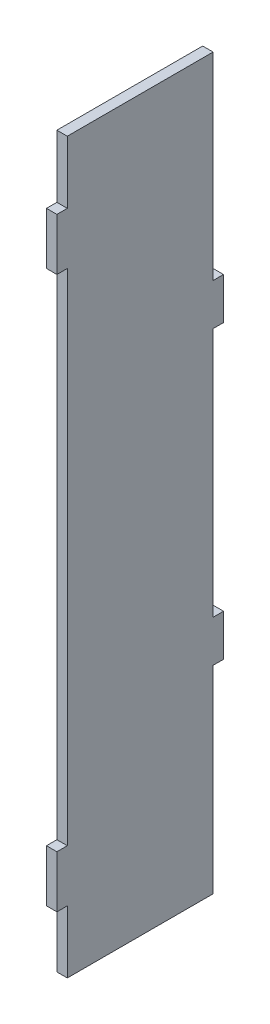
ISO-10303-21;
HEADER;
FILE_DESCRIPTION(('STEP AP214'),'2;1');
FILE_NAME('part.step','',(''),(''),'','','');
FILE_SCHEMA(('AUTOMOTIVE_DESIGN { 1 0 10303 214 1 1 1 1 }'));
ENDSEC;
DATA;
#1=APPLICATION_CONTEXT('core data for automotive mechanical design processes');
#2=APPLICATION_PROTOCOL_DEFINITION('international standard','automotive_design',2000,#1);
#3=PRODUCT_CONTEXT('',#1,'mechanical');
#4=PRODUCT('Part','Part','',(#3));
#5=PRODUCT_RELATED_PRODUCT_CATEGORY('part','',(#4));
#6=PRODUCT_DEFINITION_FORMATION('','',#4);
#7=PRODUCT_DEFINITION_CONTEXT('part definition',#1,'design');
#8=PRODUCT_DEFINITION('design','',#6,#7);
#9=PRODUCT_DEFINITION_SHAPE('','',#8);
#10=(LENGTH_UNIT() NAMED_UNIT(*) SI_UNIT(.MILLI.,.METRE.));
#11=(NAMED_UNIT(*) PLANE_ANGLE_UNIT() SI_UNIT($,.RADIAN.));
#12=(NAMED_UNIT(*) SI_UNIT($,.STERADIAN.) SOLID_ANGLE_UNIT());
#13=UNCERTAINTY_MEASURE_WITH_UNIT(LENGTH_MEASURE(1.E-05),#10,'distance_accuracy_value','');
#14=(GEOMETRIC_REPRESENTATION_CONTEXT(3) GLOBAL_UNCERTAINTY_ASSIGNED_CONTEXT((#13)) GLOBAL_UNIT_ASSIGNED_CONTEXT((#10,
#11,#12)) REPRESENTATION_CONTEXT('',''));
#15=CARTESIAN_POINT('',(0.,0.,0.));
#16=DIRECTION('',(0.,0.,1.));
#17=DIRECTION('',(1.,0.,0.));
#18=AXIS2_PLACEMENT_3D('',#15,#16,#17);
#19=CARTESIAN_POINT('',(5.,311.382366838523,56.6048264526681));
#20=DIRECTION('',(0.,0.,-1.));
#21=DIRECTION('',(0.,1.,0.));
#22=AXIS2_PLACEMENT_3D('',#19,#20,#21);
#23=PLANE('',#22);
#24=DIRECTION('',(0.,-1.,0.));
#25=VECTOR('',#24,1.);
#26=CARTESIAN_POINT('',(0.,311.382366838523,56.6048264526681));
#27=LINE('',#26,#25);
#28=CARTESIAN_POINT('',(0.,311.382366838523,56.6048264526681));
#29=VERTEX_POINT('',#28);
#30=CARTESIAN_POINT('',(0.,281.382366838523,56.604826452668));
#31=VERTEX_POINT('',#30);
#32=EDGE_CURVE('E200',#29,#31,#27,.T.);
#33=ORIENTED_EDGE('',*,*,#32,.T.);
#34=DIRECTION('',(-1.,0.,0.));
#35=VECTOR('',#34,1.);
#36=CARTESIAN_POINT('',(5.,281.382366838523,56.604826452668));
#37=LINE('',#36,#35);
#38=CARTESIAN_POINT('',(5.,281.382366838523,56.604826452668));
#39=VERTEX_POINT('',#38);
#40=EDGE_CURVE('E11',#39,#31,#37,.T.);
#41=ORIENTED_EDGE('',*,*,#40,.F.);
#42=DIRECTION('',(0.,-1.,0.));
#43=VECTOR('',#42,1.);
#44=CARTESIAN_POINT('',(5.,311.382366838523,56.6048264526681));
#45=LINE('',#44,#43);
#46=CARTESIAN_POINT('',(5.,311.382366838523,56.6048264526681));
#47=VERTEX_POINT('',#46);
#48=EDGE_CURVE('E238',#47,#39,#45,.T.);
#49=ORIENTED_EDGE('',*,*,#48,.F.);
#50=DIRECTION('',(-1.,0.,0.));
#51=VECTOR('',#50,1.);
#52=CARTESIAN_POINT('',(5.,311.382366838523,56.6048264526681));
#53=LINE('',#52,#51);
#54=EDGE_CURVE('E196',#47,#29,#53,.T.);
#55=ORIENTED_EDGE('',*,*,#54,.T.);
#56=EDGE_LOOP('',(#33,#41,#49,#55));
#57=FACE_BOUND('',#56,.T.);
#58=ADVANCED_FACE('F32',(#57),#23,.F.);
#59=CARTESIAN_POINT('',(5.,281.382366838523,56.604826452668));
#60=DIRECTION('',(0.,-1.,0.));
#61=DIRECTION('',(0.,0.,-1.));
#62=AXIS2_PLACEMENT_3D('',#59,#60,#61);
#63=PLANE('',#62);
#64=DIRECTION('',(0.,0.,1.));
#65=VECTOR('',#64,1.);
#66=CARTESIAN_POINT('',(0.,281.382366838523,56.604826452668));
#67=LINE('',#66,#65);
#68=CARTESIAN_POINT('',(0.,281.382366838523,61.604826452668));
#69=VERTEX_POINT('',#68);
#70=EDGE_CURVE('E203',#31,#69,#67,.T.);
#71=ORIENTED_EDGE('',*,*,#70,.T.);
#72=DIRECTION('',(-1.,0.,0.));
#73=VECTOR('',#72,1.);
#74=CARTESIAN_POINT('',(5.,281.382366838523,61.604826452668));
#75=LINE('',#74,#73);
#76=CARTESIAN_POINT('',(5.,281.382366838523,61.604826452668));
#77=VERTEX_POINT('',#76);
#78=EDGE_CURVE('E40',#77,#69,#75,.T.);
#79=ORIENTED_EDGE('',*,*,#78,.F.);
#80=DIRECTION('',(0.,0.,1.));
#81=VECTOR('',#80,1.);
#82=CARTESIAN_POINT('',(5.,281.382366838523,56.604826452668));
#83=LINE('',#82,#81);
#84=EDGE_CURVE('E127',#39,#77,#83,.T.);
#85=ORIENTED_EDGE('',*,*,#84,.F.);
#86=ORIENTED_EDGE('',*,*,#40,.T.);
#87=EDGE_LOOP('',(#71,#79,#85,#86));
#88=FACE_BOUND('',#87,.T.);
#89=ADVANCED_FACE('F356',(#88),#63,.F.);
#90=CARTESIAN_POINT('',(5.,281.382366838523,61.604826452668));
#91=DIRECTION('',(0.,0.,-1.));
#92=DIRECTION('',(0.,1.,0.));
#93=AXIS2_PLACEMENT_3D('',#90,#91,#92);
#94=PLANE('',#93);
#95=DIRECTION('',(0.,-1.,0.));
#96=VECTOR('',#95,1.);
#97=CARTESIAN_POINT('',(0.,281.382366838523,61.604826452668));
#98=LINE('',#97,#96);
#99=CARTESIAN_POINT('',(0.,256.382366838523,61.6048264526681));
#100=VERTEX_POINT('',#99);
#101=EDGE_CURVE('E205',#69,#100,#98,.T.);
#102=ORIENTED_EDGE('',*,*,#101,.T.);
#103=DIRECTION('',(-1.,0.,0.));
#104=VECTOR('',#103,1.);
#105=CARTESIAN_POINT('',(5.,256.382366838523,61.6048264526681));
#106=LINE('',#105,#104);
#107=CARTESIAN_POINT('',(5.,256.382366838523,61.6048264526681));
#108=VERTEX_POINT('',#107);
#109=EDGE_CURVE('E281',#108,#100,#106,.T.);
#110=ORIENTED_EDGE('',*,*,#109,.F.);
#111=DIRECTION('',(0.,-1.,0.));
#112=VECTOR('',#111,1.);
#113=CARTESIAN_POINT('',(5.,281.382366838523,61.604826452668));
#114=LINE('',#113,#112);
#115=EDGE_CURVE('E289',#77,#108,#114,.T.);
#116=ORIENTED_EDGE('',*,*,#115,.F.);
#117=ORIENTED_EDGE('',*,*,#78,.T.);
#118=EDGE_LOOP('',(#102,#110,#116,#117));
#119=FACE_BOUND('',#118,.T.);
#120=ADVANCED_FACE('F287',(#119),#94,.F.);
#121=CARTESIAN_POINT('',(5.,256.382366838523,61.6048264526681));
#122=DIRECTION('',(0.,1.,0.));
#123=DIRECTION('',(0.,0.,1.));
#124=AXIS2_PLACEMENT_3D('',#121,#122,#123);
#125=PLANE('',#124);
#126=DIRECTION('',(0.,0.,-1.));
#127=VECTOR('',#126,1.);
#128=CARTESIAN_POINT('',(0.,256.382366838523,61.6048264526681));
#129=LINE('',#128,#127);
#130=CARTESIAN_POINT('',(0.,256.382366838523,56.6048264526681));
#131=VERTEX_POINT('',#130);
#132=EDGE_CURVE('E207',#100,#131,#129,.T.);
#133=ORIENTED_EDGE('',*,*,#132,.T.);
#134=DIRECTION('',(-1.,0.,0.));
#135=VECTOR('',#134,1.);
#136=CARTESIAN_POINT('',(5.,256.382366838523,56.6048264526681));
#137=LINE('',#136,#135);
#138=CARTESIAN_POINT('',(5.,256.382366838523,56.6048264526681));
#139=VERTEX_POINT('',#138);
#140=EDGE_CURVE('E278',#139,#131,#137,.T.);
#141=ORIENTED_EDGE('',*,*,#140,.F.);
#142=DIRECTION('',(0.,0.,-1.));
#143=VECTOR('',#142,1.);
#144=CARTESIAN_POINT('',(5.,256.382366838523,61.6048264526681));
#145=LINE('',#144,#143);
#146=EDGE_CURVE('E307',#108,#139,#145,.T.);
#147=ORIENTED_EDGE('',*,*,#146,.F.);
#148=ORIENTED_EDGE('',*,*,#109,.T.);
#149=EDGE_LOOP('',(#133,#141,#147,#148));
#150=FACE_BOUND('',#149,.T.);
#151=ADVANCED_FACE('F298',(#150),#125,.F.);
#152=CARTESIAN_POINT('',(5.,256.382366838523,56.6048264526681));
#153=DIRECTION('',(0.,0.,-1.));
#154=DIRECTION('',(0.,1.,0.));
#155=AXIS2_PLACEMENT_3D('',#152,#153,#154);
#156=PLANE('',#155);
#157=DIRECTION('',(0.,-1.,0.));
#158=VECTOR('',#157,1.);
#159=CARTESIAN_POINT('',(0.,256.382366838523,56.6048264526681));
#160=LINE('',#159,#158);
#161=CARTESIAN_POINT('',(0.,16.3823668385227,56.604826452668));
#162=VERTEX_POINT('',#161);
#163=EDGE_CURVE('E209',#131,#162,#160,.T.);
#164=ORIENTED_EDGE('',*,*,#163,.T.);
#165=DIRECTION('',(-1.,0.,0.));
#166=VECTOR('',#165,1.);
#167=CARTESIAN_POINT('',(5.,16.3823668385227,56.604826452668));
#168=LINE('',#167,#166);
#169=CARTESIAN_POINT('',(5.,16.3823668385227,56.604826452668));
#170=VERTEX_POINT('',#169);
#171=EDGE_CURVE('E275',#170,#162,#168,.T.);
#172=ORIENTED_EDGE('',*,*,#171,.F.);
#173=DIRECTION('',(0.,-1.,0.));
#174=VECTOR('',#173,1.);
#175=CARTESIAN_POINT('',(5.,256.382366838523,56.6048264526681));
#176=LINE('',#175,#174);
#177=EDGE_CURVE('E304',#139,#170,#176,.T.);
#178=ORIENTED_EDGE('',*,*,#177,.F.);
#179=ORIENTED_EDGE('',*,*,#140,.T.);
#180=EDGE_LOOP('',(#164,#172,#178,#179));
#181=FACE_BOUND('',#180,.T.);
#182=ADVANCED_FACE('F302',(#181),#156,.F.);
#183=CARTESIAN_POINT('',(5.,16.3823668385227,56.604826452668));
#184=DIRECTION('',(0.,-1.,0.));
#185=DIRECTION('',(0.,0.,-1.));
#186=AXIS2_PLACEMENT_3D('',#183,#184,#185);
#187=PLANE('',#186);
#188=DIRECTION('',(0.,0.,1.));
#189=VECTOR('',#188,1.);
#190=CARTESIAN_POINT('',(0.,16.3823668385227,56.604826452668));
#191=LINE('',#190,#189);
#192=CARTESIAN_POINT('',(0.,16.3823668385227,61.604826452668));
#193=VERTEX_POINT('',#192);
#194=EDGE_CURVE('E211',#162,#193,#191,.T.);
#195=ORIENTED_EDGE('',*,*,#194,.T.);
#196=DIRECTION('',(-1.,0.,0.));
#197=VECTOR('',#196,1.);
#198=CARTESIAN_POINT('',(5.,16.3823668385227,61.604826452668));
#199=LINE('',#198,#197);
#200=CARTESIAN_POINT('',(5.,16.3823668385227,61.604826452668));
#201=VERTEX_POINT('',#200);
#202=EDGE_CURVE('E272',#201,#193,#199,.T.);
#203=ORIENTED_EDGE('',*,*,#202,.F.);
#204=DIRECTION('',(0.,0.,1.));
#205=VECTOR('',#204,1.);
#206=CARTESIAN_POINT('',(5.,16.3823668385227,56.604826452668));
#207=LINE('',#206,#205);
#208=EDGE_CURVE('E306',#170,#201,#207,.T.);
#209=ORIENTED_EDGE('',*,*,#208,.F.);
#210=ORIENTED_EDGE('',*,*,#171,.T.);
#211=EDGE_LOOP('',(#195,#203,#209,#210));
#212=FACE_BOUND('',#211,.T.);
#213=ADVANCED_FACE('F369',(#212),#187,.F.);
#214=CARTESIAN_POINT('',(5.,16.3823668385227,61.604826452668));
#215=DIRECTION('',(0.,0.,-1.));
#216=DIRECTION('',(0.,1.,0.));
#217=AXIS2_PLACEMENT_3D('',#214,#215,#216);
#218=PLANE('',#217);
#219=DIRECTION('',(0.,-1.,0.));
#220=VECTOR('',#219,1.);
#221=CARTESIAN_POINT('',(0.,16.3823668385227,61.604826452668));
#222=LINE('',#221,#220);
#223=CARTESIAN_POINT('',(0.,-8.61763316147733,61.604826452668));
#224=VERTEX_POINT('',#223);
#225=EDGE_CURVE('E213',#193,#224,#222,.T.);
#226=ORIENTED_EDGE('',*,*,#225,.T.);
#227=DIRECTION('',(-1.,0.,0.));
#228=VECTOR('',#227,1.);
#229=CARTESIAN_POINT('',(5.,-8.61763316147733,61.604826452668));
#230=LINE('',#229,#228);
#231=CARTESIAN_POINT('',(5.,-8.61763316147733,61.604826452668));
#232=VERTEX_POINT('',#231);
#233=EDGE_CURVE('E269',#232,#224,#230,.T.);
#234=ORIENTED_EDGE('',*,*,#233,.F.);
#235=DIRECTION('',(0.,-1.,0.));
#236=VECTOR('',#235,1.);
#237=CARTESIAN_POINT('',(5.,16.3823668385227,61.604826452668));
#238=LINE('',#237,#236);
#239=EDGE_CURVE('E309',#201,#232,#238,.T.);
#240=ORIENTED_EDGE('',*,*,#239,.F.);
#241=ORIENTED_EDGE('',*,*,#202,.T.);
#242=EDGE_LOOP('',(#226,#234,#240,#241));
#243=FACE_BOUND('',#242,.T.);
#244=ADVANCED_FACE('F372',(#243),#218,.F.);
#245=CARTESIAN_POINT('',(5.,-8.61763316147733,61.604826452668));
#246=DIRECTION('',(0.,1.,0.));
#247=DIRECTION('',(0.,0.,1.));
#248=AXIS2_PLACEMENT_3D('',#245,#246,#247);
#249=PLANE('',#248);
#250=DIRECTION('',(0.,0.,-1.));
#251=VECTOR('',#250,1.);
#252=CARTESIAN_POINT('',(0.,-8.61763316147733,61.604826452668));
#253=LINE('',#252,#251);
#254=CARTESIAN_POINT('',(0.,-8.61763316147733,56.604826452668));
#255=VERTEX_POINT('',#254);
#256=EDGE_CURVE('E215',#224,#255,#253,.T.);
#257=ORIENTED_EDGE('',*,*,#256,.T.);
#258=DIRECTION('',(-1.,0.,0.));
#259=VECTOR('',#258,1.);
#260=CARTESIAN_POINT('',(5.,-8.61763316147733,56.604826452668));
#261=LINE('',#260,#259);
#262=CARTESIAN_POINT('',(5.,-8.61763316147733,56.604826452668));
#263=VERTEX_POINT('',#262);
#264=EDGE_CURVE('E266',#263,#255,#261,.T.);
#265=ORIENTED_EDGE('',*,*,#264,.F.);
#266=DIRECTION('',(0.,0.,-1.));
#267=VECTOR('',#266,1.);
#268=CARTESIAN_POINT('',(5.,-8.61763316147733,61.604826452668));
#269=LINE('',#268,#267);
#270=EDGE_CURVE('E315',#232,#263,#269,.T.);
#271=ORIENTED_EDGE('',*,*,#270,.F.);
#272=ORIENTED_EDGE('',*,*,#233,.T.);
#273=EDGE_LOOP('',(#257,#265,#271,#272));
#274=FACE_BOUND('',#273,.T.);
#275=ADVANCED_FACE('F376',(#274),#249,.F.);
#276=CARTESIAN_POINT('',(5.,-8.61763316147733,56.604826452668));
#277=DIRECTION('',(0.,0.,-1.));
#278=DIRECTION('',(0.,1.,0.));
#279=AXIS2_PLACEMENT_3D('',#276,#277,#278);
#280=PLANE('',#279);
#281=DIRECTION('',(0.,-1.,0.));
#282=VECTOR('',#281,1.);
#283=CARTESIAN_POINT('',(0.,-8.61763316147733,56.604826452668));
#284=LINE('',#283,#282);
#285=CARTESIAN_POINT('',(0.,-38.6176331614773,56.604826452668));
#286=VERTEX_POINT('',#285);
#287=EDGE_CURVE('E217',#255,#286,#284,.T.);
#288=ORIENTED_EDGE('',*,*,#287,.T.);
#289=DIRECTION('',(-1.,0.,0.));
#290=VECTOR('',#289,1.);
#291=CARTESIAN_POINT('',(5.,-38.6176331614773,56.604826452668));
#292=LINE('',#291,#290);
#293=CARTESIAN_POINT('',(5.,-38.6176331614773,56.604826452668));
#294=VERTEX_POINT('',#293);
#295=EDGE_CURVE('E263',#294,#286,#292,.T.);
#296=ORIENTED_EDGE('',*,*,#295,.F.);
#297=DIRECTION('',(0.,-1.,0.));
#298=VECTOR('',#297,1.);
#299=CARTESIAN_POINT('',(5.,-8.61763316147733,56.604826452668));
#300=LINE('',#299,#298);
#301=EDGE_CURVE('E317',#263,#294,#300,.T.);
#302=ORIENTED_EDGE('',*,*,#301,.F.);
#303=ORIENTED_EDGE('',*,*,#264,.T.);
#304=EDGE_LOOP('',(#288,#296,#302,#303));
#305=FACE_BOUND('',#304,.T.);
#306=ADVANCED_FACE('F380',(#305),#280,.F.);
#307=CARTESIAN_POINT('',(5.,-38.6176331614773,56.604826452668));
#308=DIRECTION('',(0.,1.,0.));
#309=DIRECTION('',(0.,0.,1.));
#310=AXIS2_PLACEMENT_3D('',#307,#308,#309);
#311=PLANE('',#310);
#312=DIRECTION('',(0.,0.,-1.));
#313=VECTOR('',#312,1.);
#314=CARTESIAN_POINT('',(0.,-38.6176331614773,56.604826452668));
#315=LINE('',#314,#313);
#316=CARTESIAN_POINT('',(0.,-38.6176331614773,-13.395173547332));
#317=VERTEX_POINT('',#316);
#318=EDGE_CURVE('E219',#286,#317,#315,.T.);
#319=ORIENTED_EDGE('',*,*,#318,.T.);
#320=DIRECTION('',(-1.,0.,0.));
#321=VECTOR('',#320,1.);
#322=CARTESIAN_POINT('',(5.,-38.6176331614773,-13.395173547332));
#323=LINE('',#322,#321);
#324=CARTESIAN_POINT('',(5.,-38.6176331614773,-13.395173547332));
#325=VERTEX_POINT('',#324);
#326=EDGE_CURVE('E260',#325,#317,#323,.T.);
#327=ORIENTED_EDGE('',*,*,#326,.F.);
#328=DIRECTION('',(0.,0.,-1.));
#329=VECTOR('',#328,1.);
#330=CARTESIAN_POINT('',(5.,-38.6176331614773,56.604826452668));
#331=LINE('',#330,#329);
#332=EDGE_CURVE('E319',#294,#325,#331,.T.);
#333=ORIENTED_EDGE('',*,*,#332,.F.);
#334=ORIENTED_EDGE('',*,*,#295,.T.);
#335=EDGE_LOOP('',(#319,#327,#333,#334));
#336=FACE_BOUND('',#335,.T.);
#337=ADVANCED_FACE('F384',(#336),#311,.F.);
#338=CARTESIAN_POINT('',(5.,56.3823668385227,-13.395173547332));
#339=DIRECTION('',(0.,0.,1.));
#340=DIRECTION('',(1.,0.,0.));
#341=AXIS2_PLACEMENT_3D('',#338,#339,#340);
#342=PLANE('',#341);
#343=DIRECTION('',(0.,1.,0.));
#344=VECTOR('',#343,1.);
#345=CARTESIAN_POINT('',(0.,56.3823668385227,-13.395173547332));
#346=LINE('',#345,#344);
#347=CARTESIAN_POINT('',(0.,56.3823668385227,-13.395173547332));
#348=VERTEX_POINT('',#347);
#349=EDGE_CURVE('E221',#317,#348,#346,.T.);
#350=ORIENTED_EDGE('',*,*,#349,.T.);
#351=DIRECTION('',(-1.,0.,0.));
#352=VECTOR('',#351,1.);
#353=CARTESIAN_POINT('',(5.,56.3823668385227,-13.395173547332));
#354=LINE('',#353,#352);
#355=CARTESIAN_POINT('',(5.,56.3823668385227,-13.395173547332));
#356=VERTEX_POINT('',#355);
#357=EDGE_CURVE('E257',#356,#348,#354,.T.);
#358=ORIENTED_EDGE('',*,*,#357,.F.);
#359=DIRECTION('',(0.,1.,0.));
#360=VECTOR('',#359,1.);
#361=CARTESIAN_POINT('',(5.,56.3823668385227,-13.395173547332));
#362=LINE('',#361,#360);
#363=EDGE_CURVE('E321',#325,#356,#362,.T.);
#364=ORIENTED_EDGE('',*,*,#363,.F.);
#365=ORIENTED_EDGE('',*,*,#326,.T.);
#366=EDGE_LOOP('',(#350,#358,#364,#365));
#367=FACE_BOUND('',#366,.T.);
#368=ADVANCED_FACE('F388',(#367),#342,.F.);
#369=CARTESIAN_POINT('',(5.,56.3823668385227,-18.395173547332));
#370=DIRECTION('',(0.,1.,0.));
#371=DIRECTION('',(0.,0.,1.));
#372=AXIS2_PLACEMENT_3D('',#369,#370,#371);
#373=PLANE('',#372);
#374=DIRECTION('',(0.,0.,-1.));
#375=VECTOR('',#374,1.);
#376=CARTESIAN_POINT('',(0.,56.3823668385227,-18.395173547332));
#377=LINE('',#376,#375);
#378=CARTESIAN_POINT('',(0.,56.3823668385227,-18.395173547332));
#379=VERTEX_POINT('',#378);
#380=EDGE_CURVE('E223',#348,#379,#377,.T.);
#381=ORIENTED_EDGE('',*,*,#380,.T.);
#382=DIRECTION('',(-1.,0.,0.));
#383=VECTOR('',#382,1.);
#384=CARTESIAN_POINT('',(5.,56.3823668385227,-18.395173547332));
#385=LINE('',#384,#383);
#386=CARTESIAN_POINT('',(5.,56.3823668385227,-18.395173547332));
#387=VERTEX_POINT('',#386);
#388=EDGE_CURVE('E254',#387,#379,#385,.T.);
#389=ORIENTED_EDGE('',*,*,#388,.F.);
#390=DIRECTION('',(0.,0.,-1.));
#391=VECTOR('',#390,1.);
#392=CARTESIAN_POINT('',(5.,56.3823668385227,-18.395173547332));
#393=LINE('',#392,#391);
#394=EDGE_CURVE('E323',#356,#387,#393,.T.);
#395=ORIENTED_EDGE('',*,*,#394,.F.);
#396=ORIENTED_EDGE('',*,*,#357,.T.);
#397=EDGE_LOOP('',(#381,#389,#395,#396));
#398=FACE_BOUND('',#397,.T.);
#399=ADVANCED_FACE('F392',(#398),#373,.F.);
#400=CARTESIAN_POINT('',(5.,76.3823668385227,-18.395173547332));
#401=DIRECTION('',(0.,0.,1.));
#402=DIRECTION('',(1.,0.,0.));
#403=AXIS2_PLACEMENT_3D('',#400,#401,#402);
#404=PLANE('',#403);
#405=DIRECTION('',(0.,1.,0.));
#406=VECTOR('',#405,1.);
#407=CARTESIAN_POINT('',(0.,76.3823668385227,-18.395173547332));
#408=LINE('',#407,#406);
#409=CARTESIAN_POINT('',(0.,76.3823668385227,-18.395173547332));
#410=VERTEX_POINT('',#409);
#411=EDGE_CURVE('E225',#379,#410,#408,.T.);
#412=ORIENTED_EDGE('',*,*,#411,.T.);
#413=DIRECTION('',(-1.,0.,0.));
#414=VECTOR('',#413,1.);
#415=CARTESIAN_POINT('',(5.,76.3823668385227,-18.395173547332));
#416=LINE('',#415,#414);
#417=CARTESIAN_POINT('',(5.,76.3823668385227,-18.395173547332));
#418=VERTEX_POINT('',#417);
#419=EDGE_CURVE('E251',#418,#410,#416,.T.);
#420=ORIENTED_EDGE('',*,*,#419,.F.);
#421=DIRECTION('',(0.,1.,0.));
#422=VECTOR('',#421,1.);
#423=CARTESIAN_POINT('',(5.,76.3823668385227,-18.395173547332));
#424=LINE('',#423,#422);
#425=EDGE_CURVE('E325',#387,#418,#424,.T.);
#426=ORIENTED_EDGE('',*,*,#425,.F.);
#427=ORIENTED_EDGE('',*,*,#388,.T.);
#428=EDGE_LOOP('',(#412,#420,#426,#427));
#429=FACE_BOUND('',#428,.T.);
#430=ADVANCED_FACE('F396',(#429),#404,.F.);
#431=CARTESIAN_POINT('',(5.,76.3823668385227,-13.395173547332));
#432=DIRECTION('',(0.,-1.,0.));
#433=DIRECTION('',(0.,0.,-1.));
#434=AXIS2_PLACEMENT_3D('',#431,#432,#433);
#435=PLANE('',#434);
#436=DIRECTION('',(0.,0.,1.));
#437=VECTOR('',#436,1.);
#438=CARTESIAN_POINT('',(0.,76.3823668385227,-13.395173547332));
#439=LINE('',#438,#437);
#440=CARTESIAN_POINT('',(0.,76.3823668385227,-13.395173547332));
#441=VERTEX_POINT('',#440);
#442=EDGE_CURVE('E227',#410,#441,#439,.T.);
#443=ORIENTED_EDGE('',*,*,#442,.T.);
#444=DIRECTION('',(-1.,0.,0.));
#445=VECTOR('',#444,1.);
#446=CARTESIAN_POINT('',(5.,76.3823668385227,-13.395173547332));
#447=LINE('',#446,#445);
#448=CARTESIAN_POINT('',(5.,76.3823668385227,-13.395173547332));
#449=VERTEX_POINT('',#448);
#450=EDGE_CURVE('E248',#449,#441,#447,.T.);
#451=ORIENTED_EDGE('',*,*,#450,.F.);
#452=DIRECTION('',(0.,0.,1.));
#453=VECTOR('',#452,1.);
#454=CARTESIAN_POINT('',(5.,76.3823668385227,-13.395173547332));
#455=LINE('',#454,#453);
#456=EDGE_CURVE('E327',#418,#449,#455,.T.);
#457=ORIENTED_EDGE('',*,*,#456,.F.);
#458=ORIENTED_EDGE('',*,*,#419,.T.);
#459=EDGE_LOOP('',(#443,#451,#457,#458));
#460=FACE_BOUND('',#459,.T.);
#461=ADVANCED_FACE('F400',(#460),#435,.F.);
#462=CARTESIAN_POINT('',(5.,196.382366838523,-13.395173547332));
#463=DIRECTION('',(0.,0.,1.));
#464=DIRECTION('',(0.,-1.,0.));
#465=AXIS2_PLACEMENT_3D('',#462,#463,#464);
#466=PLANE('',#465);
#467=DIRECTION('',(0.,1.,0.));
#468=VECTOR('',#467,1.);
#469=CARTESIAN_POINT('',(0.,196.382366838523,-13.395173547332));
#470=LINE('',#469,#468);
#471=CARTESIAN_POINT('',(0.,196.382366838523,-13.395173547332));
#472=VERTEX_POINT('',#471);
#473=EDGE_CURVE('E229',#441,#472,#470,.T.);
#474=ORIENTED_EDGE('',*,*,#473,.T.);
#475=DIRECTION('',(-1.,0.,0.));
#476=VECTOR('',#475,1.);
#477=CARTESIAN_POINT('',(5.,196.382366838523,-13.395173547332));
#478=LINE('',#477,#476);
#479=CARTESIAN_POINT('',(5.,196.382366838523,-13.395173547332));
#480=VERTEX_POINT('',#479);
#481=EDGE_CURVE('E245',#480,#472,#478,.T.);
#482=ORIENTED_EDGE('',*,*,#481,.F.);
#483=DIRECTION('',(0.,1.,0.));
#484=VECTOR('',#483,1.);
#485=CARTESIAN_POINT('',(5.,196.382366838523,-13.395173547332));
#486=LINE('',#485,#484);
#487=EDGE_CURVE('E329',#449,#480,#486,.T.);
#488=ORIENTED_EDGE('',*,*,#487,.F.);
#489=ORIENTED_EDGE('',*,*,#450,.T.);
#490=EDGE_LOOP('',(#474,#482,#488,#489));
#491=FACE_BOUND('',#490,.T.);
#492=ADVANCED_FACE('F404',(#491),#466,.F.);
#493=CARTESIAN_POINT('',(5.,196.382366838523,-18.395173547332));
#494=DIRECTION('',(0.,1.,0.));
#495=DIRECTION('',(0.,0.,1.));
#496=AXIS2_PLACEMENT_3D('',#493,#494,#495);
#497=PLANE('',#496);
#498=DIRECTION('',(0.,0.,-1.));
#499=VECTOR('',#498,1.);
#500=CARTESIAN_POINT('',(0.,196.382366838523,-18.395173547332));
#501=LINE('',#500,#499);
#502=CARTESIAN_POINT('',(0.,196.382366838523,-18.395173547332));
#503=VERTEX_POINT('',#502);
#504=EDGE_CURVE('E231',#472,#503,#501,.T.);
#505=ORIENTED_EDGE('',*,*,#504,.T.);
#506=DIRECTION('',(-1.,0.,0.));
#507=VECTOR('',#506,1.);
#508=CARTESIAN_POINT('',(5.,196.382366838523,-18.395173547332));
#509=LINE('',#508,#507);
#510=CARTESIAN_POINT('',(5.,196.382366838523,-18.395173547332));
#511=VERTEX_POINT('',#510);
#512=EDGE_CURVE('E242',#511,#503,#509,.T.);
#513=ORIENTED_EDGE('',*,*,#512,.F.);
#514=DIRECTION('',(0.,0.,-1.));
#515=VECTOR('',#514,1.);
#516=CARTESIAN_POINT('',(5.,196.382366838523,-18.395173547332));
#517=LINE('',#516,#515);
#518=EDGE_CURVE('E331',#480,#511,#517,.T.);
#519=ORIENTED_EDGE('',*,*,#518,.F.);
#520=ORIENTED_EDGE('',*,*,#481,.T.);
#521=EDGE_LOOP('',(#505,#513,#519,#520));
#522=FACE_BOUND('',#521,.T.);
#523=ADVANCED_FACE('F337',(#522),#497,.F.);
#524=CARTESIAN_POINT('',(5.,216.382366838523,-18.395173547332));
#525=DIRECTION('',(0.,0.,1.));
#526=DIRECTION('',(1.,0.,0.));
#527=AXIS2_PLACEMENT_3D('',#524,#525,#526);
#528=PLANE('',#527);
#529=DIRECTION('',(0.,1.,0.));
#530=VECTOR('',#529,1.);
#531=CARTESIAN_POINT('',(0.,216.382366838523,-18.395173547332));
#532=LINE('',#531,#530);
#533=CARTESIAN_POINT('',(0.,216.382366838523,-18.395173547332));
#534=VERTEX_POINT('',#533);
#535=EDGE_CURVE('E233',#503,#534,#532,.T.);
#536=ORIENTED_EDGE('',*,*,#535,.T.);
#537=DIRECTION('',(-1.,0.,0.));
#538=VECTOR('',#537,1.);
#539=CARTESIAN_POINT('',(5.,216.382366838523,-18.395173547332));
#540=LINE('',#539,#538);
#541=CARTESIAN_POINT('',(5.,216.382366838523,-18.395173547332));
#542=VERTEX_POINT('',#541);
#543=EDGE_CURVE('E191',#542,#534,#540,.T.);
#544=ORIENTED_EDGE('',*,*,#543,.F.);
#545=DIRECTION('',(0.,1.,0.));
#546=VECTOR('',#545,1.);
#547=CARTESIAN_POINT('',(5.,216.382366838523,-18.395173547332));
#548=LINE('',#547,#546);
#549=EDGE_CURVE('E182',#511,#542,#548,.T.);
#550=ORIENTED_EDGE('',*,*,#549,.F.);
#551=ORIENTED_EDGE('',*,*,#512,.T.);
#552=EDGE_LOOP('',(#536,#544,#550,#551));
#553=FACE_BOUND('',#552,.T.);
#554=ADVANCED_FACE('F341',(#553),#528,.F.);
#555=CARTESIAN_POINT('',(5.,216.382366838523,-13.3951735473319));
#556=DIRECTION('',(0.,-1.,0.));
#557=DIRECTION('',(0.,0.,-1.));
#558=AXIS2_PLACEMENT_3D('',#555,#556,#557);
#559=PLANE('',#558);
#560=DIRECTION('',(0.,0.,1.));
#561=VECTOR('',#560,1.);
#562=CARTESIAN_POINT('',(0.,216.382366838523,-13.3951735473319));
#563=LINE('',#562,#561);
#564=CARTESIAN_POINT('',(0.,216.382366838523,-13.3951735473319));
#565=VERTEX_POINT('',#564);
#566=EDGE_CURVE('E190',#534,#565,#563,.T.);
#567=ORIENTED_EDGE('',*,*,#566,.T.);
#568=DIRECTION('',(-1.,0.,0.));
#569=VECTOR('',#568,1.);
#570=CARTESIAN_POINT('',(5.,216.382366838523,-13.3951735473319));
#571=LINE('',#570,#569);
#572=CARTESIAN_POINT('',(5.,216.382366838523,-13.3951735473319));
#573=VERTEX_POINT('',#572);
#574=EDGE_CURVE('E187',#573,#565,#571,.T.);
#575=ORIENTED_EDGE('',*,*,#574,.F.);
#576=DIRECTION('',(0.,0.,1.));
#577=VECTOR('',#576,1.);
#578=CARTESIAN_POINT('',(5.,216.382366838523,-13.3951735473319));
#579=LINE('',#578,#577);
#580=EDGE_CURVE('E176',#542,#573,#579,.T.);
#581=ORIENTED_EDGE('',*,*,#580,.F.);
#582=ORIENTED_EDGE('',*,*,#543,.T.);
#583=EDGE_LOOP('',(#567,#575,#581,#582));
#584=FACE_BOUND('',#583,.T.);
#585=ADVANCED_FACE('F188',(#584),#559,.F.);
#586=CARTESIAN_POINT('',(5.,311.382366838523,-13.3951735473319));
#587=DIRECTION('',(0.,0.,1.));
#588=DIRECTION('',(1.,0.,0.));
#589=AXIS2_PLACEMENT_3D('',#586,#587,#588);
#590=PLANE('',#589);
#591=DIRECTION('',(0.,1.,0.));
#592=VECTOR('',#591,1.);
#593=CARTESIAN_POINT('',(0.,311.382366838523,-13.3951735473319));
#594=LINE('',#593,#592);
#595=CARTESIAN_POINT('',(0.,311.382366838523,-13.3951735473319));
#596=VERTEX_POINT('',#595);
#597=EDGE_CURVE('E113',#565,#596,#594,.T.);
#598=ORIENTED_EDGE('',*,*,#597,.T.);
#599=DIRECTION('',(-1.,0.,0.));
#600=VECTOR('',#599,1.);
#601=CARTESIAN_POINT('',(5.,311.382366838523,-13.3951735473319));
#602=LINE('',#601,#600);
#603=CARTESIAN_POINT('',(5.,311.382366838523,-13.3951735473319));
#604=VERTEX_POINT('',#603);
#605=EDGE_CURVE('E192',#604,#596,#602,.T.);
#606=ORIENTED_EDGE('',*,*,#605,.F.);
#607=DIRECTION('',(0.,1.,0.));
#608=VECTOR('',#607,1.);
#609=CARTESIAN_POINT('',(5.,311.382366838523,-13.3951735473319));
#610=LINE('',#609,#608);
#611=EDGE_CURVE('E180',#573,#604,#610,.T.);
#612=ORIENTED_EDGE('',*,*,#611,.F.);
#613=ORIENTED_EDGE('',*,*,#574,.T.);
#614=EDGE_LOOP('',(#598,#606,#612,#613));
#615=FACE_BOUND('',#614,.T.);
#616=ADVANCED_FACE('F194',(#615),#590,.F.);
#617=CARTESIAN_POINT('',(5.,311.382366838523,56.6048264526681));
#618=DIRECTION('',(0.,-1.,0.));
#619=DIRECTION('',(0.,0.,-1.));
#620=AXIS2_PLACEMENT_3D('',#617,#618,#619);
#621=PLANE('',#620);
#622=DIRECTION('',(0.,0.,1.));
#623=VECTOR('',#622,1.);
#624=CARTESIAN_POINT('',(0.,311.382366838523,56.6048264526681));
#625=LINE('',#624,#623);
#626=EDGE_CURVE('E119',#596,#29,#625,.T.);
#627=ORIENTED_EDGE('',*,*,#626,.T.);
#628=ORIENTED_EDGE('',*,*,#54,.F.);
#629=DIRECTION('',(0.,0.,1.));
#630=VECTOR('',#629,1.);
#631=CARTESIAN_POINT('',(5.,311.382366838523,56.6048264526681));
#632=LINE('',#631,#630);
#633=EDGE_CURVE('E48',#604,#47,#632,.T.);
#634=ORIENTED_EDGE('',*,*,#633,.F.);
#635=ORIENTED_EDGE('',*,*,#605,.T.);
#636=EDGE_LOOP('',(#627,#628,#634,#635));
#637=FACE_BOUND('',#636,.T.);
#638=ADVANCED_FACE('F345',(#637),#621,.F.);
#639=CARTESIAN_POINT('',(5.,0.,0.));
#640=DIRECTION('',(-1.,0.,0.));
#641=DIRECTION('',(0.,0.,1.));
#642=AXIS2_PLACEMENT_3D('',#639,#640,#641);
#643=PLANE('',#642);
#644=ORIENTED_EDGE('',*,*,#48,.T.);
#645=ORIENTED_EDGE('',*,*,#84,.T.);
#646=ORIENTED_EDGE('',*,*,#115,.T.);
#647=ORIENTED_EDGE('',*,*,#146,.T.);
#648=ORIENTED_EDGE('',*,*,#177,.T.);
#649=ORIENTED_EDGE('',*,*,#208,.T.);
#650=ORIENTED_EDGE('',*,*,#239,.T.);
#651=ORIENTED_EDGE('',*,*,#270,.T.);
#652=ORIENTED_EDGE('',*,*,#301,.T.);
#653=ORIENTED_EDGE('',*,*,#332,.T.);
#654=ORIENTED_EDGE('',*,*,#363,.T.);
#655=ORIENTED_EDGE('',*,*,#394,.T.);
#656=ORIENTED_EDGE('',*,*,#425,.T.);
#657=ORIENTED_EDGE('',*,*,#456,.T.);
#658=ORIENTED_EDGE('',*,*,#487,.T.);
#659=ORIENTED_EDGE('',*,*,#518,.T.);
#660=ORIENTED_EDGE('',*,*,#549,.T.);
#661=ORIENTED_EDGE('',*,*,#580,.T.);
#662=ORIENTED_EDGE('',*,*,#611,.T.);
#663=ORIENTED_EDGE('',*,*,#633,.T.);
#664=EDGE_LOOP('',(#644,#645,#646,#647,#648,#649,#650,#651,#652,#653,#654,#655,#656,#657,#658,
#659,#660,#661,#662,#663));
#665=FACE_BOUND('',#664,.T.);
#666=ADVANCED_FACE('F178',(#665),#643,.F.);
#667=CARTESIAN_POINT('',(0.,0.,0.));
#668=DIRECTION('',(-1.,0.,0.));
#669=DIRECTION('',(0.,0.,1.));
#670=AXIS2_PLACEMENT_3D('',#667,#668,#669);
#671=PLANE('',#670);
#672=ORIENTED_EDGE('',*,*,#32,.F.);
#673=ORIENTED_EDGE('',*,*,#626,.F.);
#674=ORIENTED_EDGE('',*,*,#597,.F.);
#675=ORIENTED_EDGE('',*,*,#566,.F.);
#676=ORIENTED_EDGE('',*,*,#535,.F.);
#677=ORIENTED_EDGE('',*,*,#504,.F.);
#678=ORIENTED_EDGE('',*,*,#473,.F.);
#679=ORIENTED_EDGE('',*,*,#442,.F.);
#680=ORIENTED_EDGE('',*,*,#411,.F.);
#681=ORIENTED_EDGE('',*,*,#380,.F.);
#682=ORIENTED_EDGE('',*,*,#349,.F.);
#683=ORIENTED_EDGE('',*,*,#318,.F.);
#684=ORIENTED_EDGE('',*,*,#287,.F.);
#685=ORIENTED_EDGE('',*,*,#256,.F.);
#686=ORIENTED_EDGE('',*,*,#225,.F.);
#687=ORIENTED_EDGE('',*,*,#194,.F.);
#688=ORIENTED_EDGE('',*,*,#163,.F.);
#689=ORIENTED_EDGE('',*,*,#132,.F.);
#690=ORIENTED_EDGE('',*,*,#101,.F.);
#691=ORIENTED_EDGE('',*,*,#70,.F.);
#692=EDGE_LOOP('',(#672,#673,#674,#675,#676,#677,#678,#679,#680,#681,#682,#683,#684,#685,#686,
#687,#688,#689,#690,#691));
#693=FACE_BOUND('',#692,.T.);
#694=ADVANCED_FACE('F293',(#693),#671,.T.);
#695=CLOSED_SHELL('',(#58,#89,#120,#151,#182,#213,#244,#275,#306,#337,#368,#399,#430,#461,#492,
#523,#554,#585,#616,#638,#666,#694));
#696=MANIFOLD_SOLID_BREP('B2',#695);
#697=ADVANCED_BREP_SHAPE_REPRESENTATION('',(#18,#696),#14);
#698=SHAPE_DEFINITION_REPRESENTATION(#9,#697);
ENDSEC;
END-ISO-10303-21;
